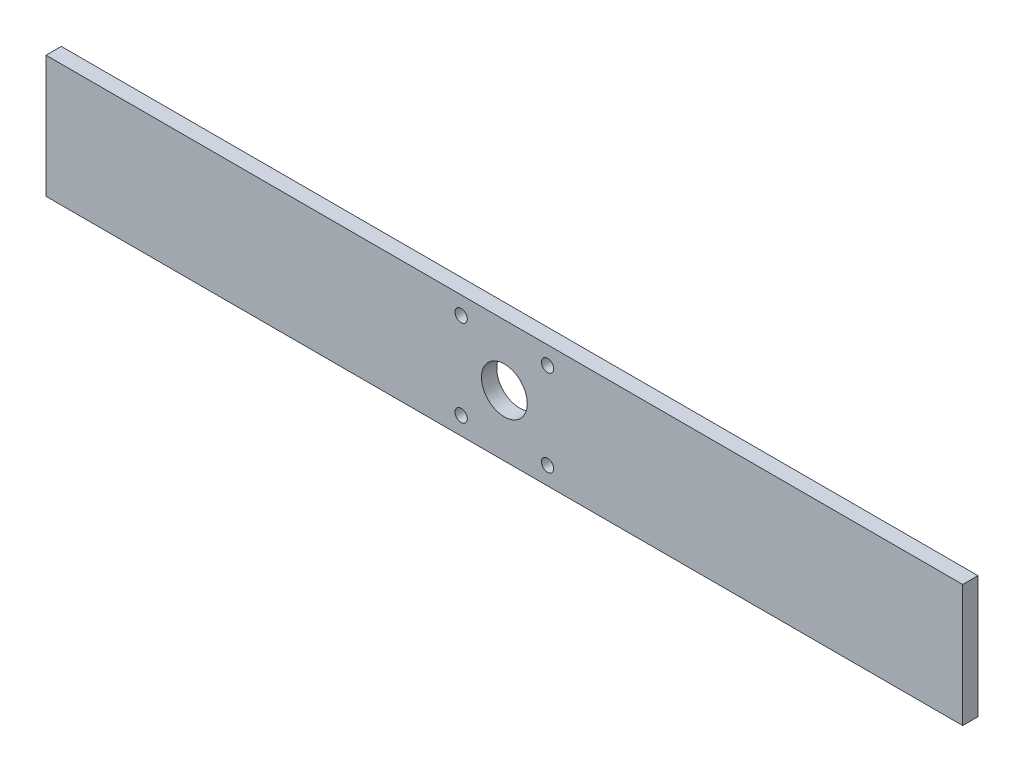
ISO-10303-21;
HEADER;
FILE_DESCRIPTION(('STEP AP214'),'2;1');
FILE_NAME('part.step','',(''),(''),'','','');
FILE_SCHEMA(('AUTOMOTIVE_DESIGN { 1 0 10303 214 1 1 1 1 }'));
ENDSEC;
DATA;
#1=APPLICATION_CONTEXT('core data for automotive mechanical design processes');
#2=APPLICATION_PROTOCOL_DEFINITION('international standard','automotive_design',2000,#1);
#3=PRODUCT_CONTEXT('',#1,'mechanical');
#4=PRODUCT('Part','Part','',(#3));
#5=PRODUCT_RELATED_PRODUCT_CATEGORY('part','',(#4));
#6=PRODUCT_DEFINITION_FORMATION('','',#4);
#7=PRODUCT_DEFINITION_CONTEXT('part definition',#1,'design');
#8=PRODUCT_DEFINITION('design','',#6,#7);
#9=PRODUCT_DEFINITION_SHAPE('','',#8);
#10=(LENGTH_UNIT() NAMED_UNIT(*) SI_UNIT(.MILLI.,.METRE.));
#11=(NAMED_UNIT(*) PLANE_ANGLE_UNIT() SI_UNIT($,.RADIAN.));
#12=(NAMED_UNIT(*) SI_UNIT($,.STERADIAN.) SOLID_ANGLE_UNIT());
#13=UNCERTAINTY_MEASURE_WITH_UNIT(LENGTH_MEASURE(1.E-05),#10,'distance_accuracy_value','');
#14=(GEOMETRIC_REPRESENTATION_CONTEXT(3) GLOBAL_UNCERTAINTY_ASSIGNED_CONTEXT((#13)) GLOBAL_UNIT_ASSIGNED_CONTEXT((#10,
#11,#12)) REPRESENTATION_CONTEXT('',''));
#15=CARTESIAN_POINT('',(0.,0.,0.));
#16=DIRECTION('',(0.,0.,1.));
#17=DIRECTION('',(1.,0.,0.));
#18=AXIS2_PLACEMENT_3D('',#15,#16,#17);
#19=CARTESIAN_POINT('',(190.5,25.4,0.));
#20=DIRECTION('',(0.,0.,-1.));
#21=DIRECTION('',(-1.,0.,0.));
#22=AXIS2_PLACEMENT_3D('',#19,#20,#21);
#23=PLANE('',#22);
#24=DIRECTION('',(0.,1.,0.));
#25=VECTOR('',#24,1.);
#26=CARTESIAN_POINT('',(190.5,-25.4,0.));
#27=LINE('',#26,#25);
#28=CARTESIAN_POINT('',(190.5,-25.4,0.));
#29=VERTEX_POINT('',#28);
#30=CARTESIAN_POINT('',(190.5,25.4,0.));
#31=VERTEX_POINT('',#30);
#32=EDGE_CURVE('E99',#29,#31,#27,.T.);
#33=ORIENTED_EDGE('',*,*,#32,.F.);
#34=DIRECTION('',(1.,0.,0.));
#35=VECTOR('',#34,1.);
#36=CARTESIAN_POINT('',(-190.5,-25.4,0.));
#37=LINE('',#36,#35);
#38=CARTESIAN_POINT('',(-190.5,-25.4,0.));
#39=VERTEX_POINT('',#38);
#40=EDGE_CURVE('E75',#39,#29,#37,.T.);
#41=ORIENTED_EDGE('',*,*,#40,.F.);
#42=DIRECTION('',(0.,-1.,0.));
#43=VECTOR('',#42,1.);
#44=CARTESIAN_POINT('',(-190.5,-25.4,0.));
#45=LINE('',#44,#43);
#46=CARTESIAN_POINT('',(-190.5,25.4,0.));
#47=VERTEX_POINT('',#46);
#48=EDGE_CURVE('E69',#47,#39,#45,.T.);
#49=ORIENTED_EDGE('',*,*,#48,.F.);
#50=DIRECTION('',(-1.,0.,0.));
#51=VECTOR('',#50,1.);
#52=CARTESIAN_POINT('',(-190.5,25.4,0.));
#53=LINE('',#52,#51);
#54=EDGE_CURVE('E91',#31,#47,#53,.T.);
#55=ORIENTED_EDGE('',*,*,#54,.F.);
#56=EDGE_LOOP('',(#33,#41,#49,#55));
#57=FACE_BOUND('',#56,.T.);
#58=CARTESIAN_POINT('',(0.,0.,0.));
#59=DIRECTION('',(0.,0.,1.));
#60=DIRECTION('',(1.,0.,0.));
#61=AXIS2_PLACEMENT_3D('',#58,#59,#60);
#62=CIRCLE('',#61,9.525);
#63=CARTESIAN_POINT('',(9.525,0.,0.));
#64=VERTEX_POINT('',#63);
#65=EDGE_CURVE('E102',#64,#64,#62,.T.);
#66=ORIENTED_EDGE('',*,*,#65,.T.);
#67=EDGE_LOOP('',(#66));
#68=FACE_BOUND('',#67,.T.);
#69=CARTESIAN_POINT('',(17.9605122421384,17.9605122421382,0.));
#70=DIRECTION('',(0.,0.,1.));
#71=DIRECTION('',(1.,0.,0.));
#72=AXIS2_PLACEMENT_3D('',#69,#70,#71);
#73=CIRCLE('',#72,2.5527);
#74=CARTESIAN_POINT('',(20.5132122421384,17.9605122421382,0.));
#75=VERTEX_POINT('',#74);
#76=EDGE_CURVE('E116',#75,#75,#73,.T.);
#77=ORIENTED_EDGE('',*,*,#76,.T.);
#78=EDGE_LOOP('',(#77));
#79=FACE_BOUND('',#78,.T.);
#80=CARTESIAN_POINT('',(-17.9605122421383,17.9605122421383,0.));
#81=DIRECTION('',(0.,0.,1.));
#82=DIRECTION('',(1.,0.,0.));
#83=AXIS2_PLACEMENT_3D('',#80,#81,#82);
#84=CIRCLE('',#83,2.5527);
#85=CARTESIAN_POINT('',(-15.4078122421383,17.9605122421383,0.));
#86=VERTEX_POINT('',#85);
#87=EDGE_CURVE('E124',#86,#86,#84,.T.);
#88=ORIENTED_EDGE('',*,*,#87,.T.);
#89=EDGE_LOOP('',(#88));
#90=FACE_BOUND('',#89,.T.);
#91=CARTESIAN_POINT('',(-17.9605122421384,-17.9605122421382,0.));
#92=DIRECTION('',(0.,0.,1.));
#93=DIRECTION('',(1.,0.,0.));
#94=AXIS2_PLACEMENT_3D('',#91,#92,#93);
#95=CIRCLE('',#94,2.5527);
#96=CARTESIAN_POINT('',(-15.4078122421384,-17.9605122421382,0.));
#97=VERTEX_POINT('',#96);
#98=EDGE_CURVE('E130',#97,#97,#95,.T.);
#99=ORIENTED_EDGE('',*,*,#98,.T.);
#100=EDGE_LOOP('',(#99));
#101=FACE_BOUND('',#100,.T.);
#102=CARTESIAN_POINT('',(17.9605122421384,-17.9605122421382,0.));
#103=DIRECTION('',(0.,0.,1.));
#104=DIRECTION('',(1.,0.,0.));
#105=AXIS2_PLACEMENT_3D('',#102,#103,#104);
#106=CIRCLE('',#105,2.5527);
#107=CARTESIAN_POINT('',(20.5132122421384,-17.9605122421382,0.));
#108=VERTEX_POINT('',#107);
#109=EDGE_CURVE('E136',#108,#108,#106,.T.);
#110=ORIENTED_EDGE('',*,*,#109,.T.);
#111=EDGE_LOOP('',(#110));
#112=FACE_BOUND('',#111,.T.);
#113=ADVANCED_FACE('F35',(#57,#68,#79,#90,#101,#112),#23,.T.);
#114=CARTESIAN_POINT('',(190.5,-25.4,6.35));
#115=DIRECTION('',(-1.,0.,0.));
#116=DIRECTION('',(0.,0.,1.));
#117=AXIS2_PLACEMENT_3D('',#114,#115,#116);
#118=PLANE('',#117);
#119=ORIENTED_EDGE('',*,*,#32,.T.);
#120=DIRECTION('',(0.,0.,-1.));
#121=VECTOR('',#120,1.);
#122=CARTESIAN_POINT('',(190.5,25.4,6.35));
#123=LINE('',#122,#121);
#124=CARTESIAN_POINT('',(190.5,25.4,6.35));
#125=VERTEX_POINT('',#124);
#126=EDGE_CURVE('E11',#125,#31,#123,.T.);
#127=ORIENTED_EDGE('',*,*,#126,.F.);
#128=DIRECTION('',(0.,1.,0.));
#129=VECTOR('',#128,1.);
#130=CARTESIAN_POINT('',(190.5,-25.4,6.35));
#131=LINE('',#130,#129);
#132=CARTESIAN_POINT('',(190.5,-25.4,6.35));
#133=VERTEX_POINT('',#132);
#134=EDGE_CURVE('E87',#133,#125,#131,.T.);
#135=ORIENTED_EDGE('',*,*,#134,.F.);
#136=DIRECTION('',(0.,0.,-1.));
#137=VECTOR('',#136,1.);
#138=CARTESIAN_POINT('',(190.5,-25.4,6.35));
#139=LINE('',#138,#137);
#140=EDGE_CURVE('E95',#133,#29,#139,.T.);
#141=ORIENTED_EDGE('',*,*,#140,.T.);
#142=EDGE_LOOP('',(#119,#127,#135,#141));
#143=FACE_BOUND('',#142,.T.);
#144=ADVANCED_FACE('F37',(#143),#118,.F.);
#145=CARTESIAN_POINT('',(-190.5,25.4,6.35));
#146=DIRECTION('',(0.,-1.,0.));
#147=DIRECTION('',(0.,0.,-1.));
#148=AXIS2_PLACEMENT_3D('',#145,#146,#147);
#149=PLANE('',#148);
#150=ORIENTED_EDGE('',*,*,#54,.T.);
#151=DIRECTION('',(0.,0.,-1.));
#152=VECTOR('',#151,1.);
#153=CARTESIAN_POINT('',(-190.5,25.4,6.35));
#154=LINE('',#153,#152);
#155=CARTESIAN_POINT('',(-190.5,25.4,6.35));
#156=VERTEX_POINT('',#155);
#157=EDGE_CURVE('E44',#156,#47,#154,.T.);
#158=ORIENTED_EDGE('',*,*,#157,.F.);
#159=DIRECTION('',(-1.,0.,0.));
#160=VECTOR('',#159,1.);
#161=CARTESIAN_POINT('',(-190.5,25.4,6.35));
#162=LINE('',#161,#160);
#163=EDGE_CURVE('E82',#125,#156,#162,.T.);
#164=ORIENTED_EDGE('',*,*,#163,.F.);
#165=ORIENTED_EDGE('',*,*,#126,.T.);
#166=EDGE_LOOP('',(#150,#158,#164,#165));
#167=FACE_BOUND('',#166,.T.);
#168=ADVANCED_FACE('F90',(#167),#149,.F.);
#169=CARTESIAN_POINT('',(-190.5,-25.4,6.35));
#170=DIRECTION('',(1.,0.,0.));
#171=DIRECTION('',(0.,0.,-1.));
#172=AXIS2_PLACEMENT_3D('',#169,#170,#171);
#173=PLANE('',#172);
#174=ORIENTED_EDGE('',*,*,#48,.T.);
#175=DIRECTION('',(0.,0.,-1.));
#176=VECTOR('',#175,1.);
#177=CARTESIAN_POINT('',(-190.5,-25.4,6.35));
#178=LINE('',#177,#176);
#179=CARTESIAN_POINT('',(-190.5,-25.4,6.35));
#180=VERTEX_POINT('',#179);
#181=EDGE_CURVE('E92',#180,#39,#178,.T.);
#182=ORIENTED_EDGE('',*,*,#181,.F.);
#183=DIRECTION('',(0.,-1.,0.));
#184=VECTOR('',#183,1.);
#185=CARTESIAN_POINT('',(-190.5,-25.4,6.35));
#186=LINE('',#185,#184);
#187=EDGE_CURVE('E85',#156,#180,#186,.T.);
#188=ORIENTED_EDGE('',*,*,#187,.F.);
#189=ORIENTED_EDGE('',*,*,#157,.T.);
#190=EDGE_LOOP('',(#174,#182,#188,#189));
#191=FACE_BOUND('',#190,.T.);
#192=ADVANCED_FACE('F93',(#191),#173,.F.);
#193=CARTESIAN_POINT('',(-190.5,-25.4,6.35));
#194=DIRECTION('',(0.,1.,0.));
#195=DIRECTION('',(0.,0.,1.));
#196=AXIS2_PLACEMENT_3D('',#193,#194,#195);
#197=PLANE('',#196);
#198=ORIENTED_EDGE('',*,*,#40,.T.);
#199=ORIENTED_EDGE('',*,*,#140,.F.);
#200=DIRECTION('',(1.,0.,0.));
#201=VECTOR('',#200,1.);
#202=CARTESIAN_POINT('',(-190.5,-25.4,6.35));
#203=LINE('',#202,#201);
#204=EDGE_CURVE('E52',#180,#133,#203,.T.);
#205=ORIENTED_EDGE('',*,*,#204,.F.);
#206=ORIENTED_EDGE('',*,*,#181,.T.);
#207=EDGE_LOOP('',(#198,#199,#205,#206));
#208=FACE_BOUND('',#207,.T.);
#209=ADVANCED_FACE('F107',(#208),#197,.F.);
#210=CARTESIAN_POINT('',(190.5,25.4,6.35));
#211=DIRECTION('',(0.,0.,-1.));
#212=DIRECTION('',(-1.,0.,0.));
#213=AXIS2_PLACEMENT_3D('',#210,#211,#212);
#214=PLANE('',#213);
#215=CARTESIAN_POINT('',(17.9605122421384,-17.9605122421382,6.35));
#216=DIRECTION('',(0.,0.,1.));
#217=DIRECTION('',(1.,0.,0.));
#218=AXIS2_PLACEMENT_3D('',#215,#216,#217);
#219=CIRCLE('',#218,2.55269999999999);
#220=CARTESIAN_POINT('',(20.5132122421384,-17.9605122421382,6.35));
#221=VERTEX_POINT('',#220);
#222=EDGE_CURVE('E139',#221,#221,#219,.T.);
#223=ORIENTED_EDGE('',*,*,#222,.F.);
#224=EDGE_LOOP('',(#223));
#225=FACE_BOUND('',#224,.T.);
#226=CARTESIAN_POINT('',(-17.9605122421384,-17.9605122421382,6.35));
#227=DIRECTION('',(0.,0.,1.));
#228=DIRECTION('',(1.,0.,0.));
#229=AXIS2_PLACEMENT_3D('',#226,#227,#228);
#230=CIRCLE('',#229,2.55269999999999);
#231=CARTESIAN_POINT('',(-15.4078122421384,-17.9605122421382,6.35));
#232=VERTEX_POINT('',#231);
#233=EDGE_CURVE('E133',#232,#232,#230,.T.);
#234=ORIENTED_EDGE('',*,*,#233,.F.);
#235=EDGE_LOOP('',(#234));
#236=FACE_BOUND('',#235,.T.);
#237=CARTESIAN_POINT('',(-17.9605122421383,17.9605122421383,6.35));
#238=DIRECTION('',(0.,0.,1.));
#239=DIRECTION('',(1.,0.,0.));
#240=AXIS2_PLACEMENT_3D('',#237,#238,#239);
#241=CIRCLE('',#240,2.55269999999999);
#242=CARTESIAN_POINT('',(-15.4078122421383,17.9605122421383,6.35));
#243=VERTEX_POINT('',#242);
#244=EDGE_CURVE('E127',#243,#243,#241,.T.);
#245=ORIENTED_EDGE('',*,*,#244,.F.);
#246=EDGE_LOOP('',(#245));
#247=FACE_BOUND('',#246,.T.);
#248=CARTESIAN_POINT('',(17.9605122421384,17.9605122421382,6.35));
#249=DIRECTION('',(0.,0.,1.));
#250=DIRECTION('',(1.,0.,0.));
#251=AXIS2_PLACEMENT_3D('',#248,#249,#250);
#252=CIRCLE('',#251,2.55269999999999);
#253=CARTESIAN_POINT('',(20.5132122421384,17.9605122421382,6.35));
#254=VERTEX_POINT('',#253);
#255=EDGE_CURVE('E121',#254,#254,#252,.T.);
#256=ORIENTED_EDGE('',*,*,#255,.F.);
#257=EDGE_LOOP('',(#256));
#258=FACE_BOUND('',#257,.T.);
#259=CARTESIAN_POINT('',(0.,0.,6.35));
#260=DIRECTION('',(0.,0.,1.));
#261=DIRECTION('',(1.,0.,0.));
#262=AXIS2_PLACEMENT_3D('',#259,#260,#261);
#263=CIRCLE('',#262,9.525);
#264=CARTESIAN_POINT('',(9.525,0.,6.35));
#265=VERTEX_POINT('',#264);
#266=EDGE_CURVE('E113',#265,#265,#263,.T.);
#267=ORIENTED_EDGE('',*,*,#266,.F.);
#268=EDGE_LOOP('',(#267));
#269=FACE_BOUND('',#268,.T.);
#270=ORIENTED_EDGE('',*,*,#134,.T.);
#271=ORIENTED_EDGE('',*,*,#163,.T.);
#272=ORIENTED_EDGE('',*,*,#187,.T.);
#273=ORIENTED_EDGE('',*,*,#204,.T.);
#274=EDGE_LOOP('',(#270,#271,#272,#273));
#275=FACE_BOUND('',#274,.T.);
#276=ADVANCED_FACE('F83',(#225,#236,#247,#258,#269,#275),#214,.F.);
#277=CARTESIAN_POINT('',(0.,0.,0.));
#278=DIRECTION('',(0.,0.,1.));
#279=DIRECTION('',(1.,0.,0.));
#280=AXIS2_PLACEMENT_3D('',#277,#278,#279);
#281=CYLINDRICAL_SURFACE('',#280,9.525);
#282=ORIENTED_EDGE('',*,*,#65,.F.);
#283=EDGE_LOOP('',(#282));
#284=FACE_BOUND('',#283,.T.);
#285=ORIENTED_EDGE('',*,*,#266,.T.);
#286=EDGE_LOOP('',(#285));
#287=FACE_BOUND('',#286,.T.);
#288=ADVANCED_FACE('F147',(#284,#287),#281,.F.);
#289=CARTESIAN_POINT('',(17.9605122421384,17.9605122421382,6.35));
#290=DIRECTION('',(0.,0.,1.));
#291=DIRECTION('',(1.,0.,0.));
#292=AXIS2_PLACEMENT_3D('',#289,#290,#291);
#293=CYLINDRICAL_SURFACE('',#292,2.55269999999999);
#294=ORIENTED_EDGE('',*,*,#76,.F.);
#295=EDGE_LOOP('',(#294));
#296=FACE_BOUND('',#295,.T.);
#297=ORIENTED_EDGE('',*,*,#255,.T.);
#298=EDGE_LOOP('',(#297));
#299=FACE_BOUND('',#298,.T.);
#300=ADVANCED_FACE('F158',(#296,#299),#293,.F.);
#301=CARTESIAN_POINT('',(-17.9605122421383,17.9605122421383,6.35));
#302=DIRECTION('',(0.,0.,1.));
#303=DIRECTION('',(1.,0.,0.));
#304=AXIS2_PLACEMENT_3D('',#301,#302,#303);
#305=CYLINDRICAL_SURFACE('',#304,2.55269999999999);
#306=ORIENTED_EDGE('',*,*,#87,.F.);
#307=EDGE_LOOP('',(#306));
#308=FACE_BOUND('',#307,.T.);
#309=ORIENTED_EDGE('',*,*,#244,.T.);
#310=EDGE_LOOP('',(#309));
#311=FACE_BOUND('',#310,.T.);
#312=ADVANCED_FACE('F164',(#308,#311),#305,.F.);
#313=CARTESIAN_POINT('',(-17.9605122421384,-17.9605122421382,6.35));
#314=DIRECTION('',(0.,0.,1.));
#315=DIRECTION('',(1.,0.,0.));
#316=AXIS2_PLACEMENT_3D('',#313,#314,#315);
#317=CYLINDRICAL_SURFACE('',#316,2.55269999999999);
#318=ORIENTED_EDGE('',*,*,#98,.F.);
#319=EDGE_LOOP('',(#318));
#320=FACE_BOUND('',#319,.T.);
#321=ORIENTED_EDGE('',*,*,#233,.T.);
#322=EDGE_LOOP('',(#321));
#323=FACE_BOUND('',#322,.T.);
#324=ADVANCED_FACE('F207',(#320,#323),#317,.F.);
#325=CARTESIAN_POINT('',(17.9605122421384,-17.9605122421382,6.35));
#326=DIRECTION('',(0.,0.,1.));
#327=DIRECTION('',(1.,0.,0.));
#328=AXIS2_PLACEMENT_3D('',#325,#326,#327);
#329=CYLINDRICAL_SURFACE('',#328,2.55269999999999);
#330=ORIENTED_EDGE('',*,*,#109,.F.);
#331=EDGE_LOOP('',(#330));
#332=FACE_BOUND('',#331,.T.);
#333=ORIENTED_EDGE('',*,*,#222,.T.);
#334=EDGE_LOOP('',(#333));
#335=FACE_BOUND('',#334,.T.);
#336=ADVANCED_FACE('F143',(#332,#335),#329,.F.);
#337=CLOSED_SHELL('',(#113,#144,#168,#192,#209,#276,#288,#300,#312,#324,#336));
#338=MANIFOLD_SOLID_BREP('B2',#337);
#339=ADVANCED_BREP_SHAPE_REPRESENTATION('',(#18,#338),#14);
#340=SHAPE_DEFINITION_REPRESENTATION(#9,#339);
ENDSEC;
END-ISO-10303-21;
